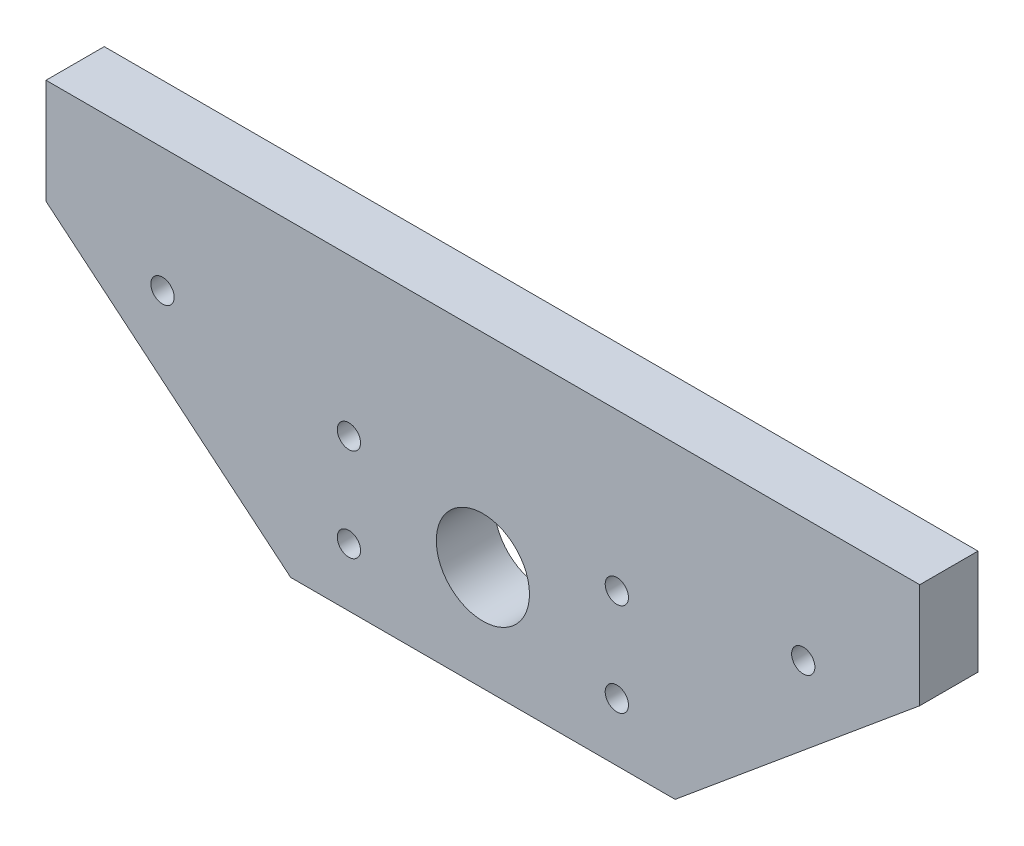
ISO-10303-21;
HEADER;
FILE_DESCRIPTION(('STEP AP214'),'2;1');
FILE_NAME('part.step','',(''),(''),'','','');
FILE_SCHEMA(('AUTOMOTIVE_DESIGN { 1 0 10303 214 1 1 1 1 }'));
ENDSEC;
DATA;
#1=APPLICATION_CONTEXT('core data for automotive mechanical design processes');
#2=APPLICATION_PROTOCOL_DEFINITION('international standard','automotive_design',2000,#1);
#3=PRODUCT_CONTEXT('',#1,'mechanical');
#4=PRODUCT('Part','Part','',(#3));
#5=PRODUCT_RELATED_PRODUCT_CATEGORY('part','',(#4));
#6=PRODUCT_DEFINITION_FORMATION('','',#4);
#7=PRODUCT_DEFINITION_CONTEXT('part definition',#1,'design');
#8=PRODUCT_DEFINITION('design','',#6,#7);
#9=PRODUCT_DEFINITION_SHAPE('','',#8);
#10=(LENGTH_UNIT() NAMED_UNIT(*) SI_UNIT(.MILLI.,.METRE.));
#11=(NAMED_UNIT(*) PLANE_ANGLE_UNIT() SI_UNIT($,.RADIAN.));
#12=(NAMED_UNIT(*) SI_UNIT($,.STERADIAN.) SOLID_ANGLE_UNIT());
#13=UNCERTAINTY_MEASURE_WITH_UNIT(LENGTH_MEASURE(1.E-05),#10,'distance_accuracy_value','');
#14=(GEOMETRIC_REPRESENTATION_CONTEXT(3) GLOBAL_UNCERTAINTY_ASSIGNED_CONTEXT((#13)) GLOBAL_UNIT_ASSIGNED_CONTEXT((#10,
#11,#12)) REPRESENTATION_CONTEXT('',''));
#15=CARTESIAN_POINT('',(0.,0.,0.));
#16=DIRECTION('',(0.,0.,1.));
#17=DIRECTION('',(1.,0.,0.));
#18=AXIS2_PLACEMENT_3D('',#15,#16,#17);
#19=CARTESIAN_POINT('',(0.,0.,10.));
#20=DIRECTION('',(0.,0.,1.));
#21=DIRECTION('',(1.,0.,0.));
#22=AXIS2_PLACEMENT_3D('',#19,#20,#21);
#23=PLANE('',#22);
#24=DIRECTION('',(-0.768948531530423,-0.639310688051753,0.));
#25=VECTOR('',#24,1.);
#26=CARTESIAN_POINT('',(75.,16.9191757278377,10.));
#27=LINE('',#26,#25);
#28=CARTESIAN_POINT('',(75.,16.9191757278377,10.));
#29=VERTEX_POINT('',#28);
#30=CARTESIAN_POINT('',(33.,-18.,10.));
#31=VERTEX_POINT('',#30);
#32=EDGE_CURVE('E155',#29,#31,#27,.T.);
#33=ORIENTED_EDGE('',*,*,#32,.F.);
#34=DIRECTION('',(0.,1.,0.));
#35=VECTOR('',#34,1.);
#36=CARTESIAN_POINT('',(75.,34.9191757278377,10.));
#37=LINE('',#36,#35);
#38=CARTESIAN_POINT('',(75.,34.9191757278377,10.));
#39=VERTEX_POINT('',#38);
#40=EDGE_CURVE('E95',#29,#39,#37,.T.);
#41=ORIENTED_EDGE('',*,*,#40,.T.);
#42=DIRECTION('',(-1.,0.,0.));
#43=VECTOR('',#42,1.);
#44=CARTESIAN_POINT('',(-75.,34.9191757278377,10.));
#45=LINE('',#44,#43);
#46=CARTESIAN_POINT('',(-75.,34.9191757278377,10.));
#47=VERTEX_POINT('',#46);
#48=EDGE_CURVE('E61',#39,#47,#45,.T.);
#49=ORIENTED_EDGE('',*,*,#48,.T.);
#50=DIRECTION('',(0.,-1.,0.));
#51=VECTOR('',#50,1.);
#52=CARTESIAN_POINT('',(-75.,34.9191757278377,10.));
#53=LINE('',#52,#51);
#54=CARTESIAN_POINT('',(-75.,16.9191757278377,10.));
#55=VERTEX_POINT('',#54);
#56=EDGE_CURVE('E88',#47,#55,#53,.T.);
#57=ORIENTED_EDGE('',*,*,#56,.T.);
#58=DIRECTION('',(-0.768948531530424,0.639310688051752,0.));
#59=VECTOR('',#58,1.);
#60=CARTESIAN_POINT('',(-75.,16.9191757278377,10.));
#61=LINE('',#60,#59);
#62=CARTESIAN_POINT('',(-33.,-18.,10.));
#63=VERTEX_POINT('',#62);
#64=EDGE_CURVE('E52',#63,#55,#61,.T.);
#65=ORIENTED_EDGE('',*,*,#64,.F.);
#66=DIRECTION('',(-1.,0.,0.));
#67=VECTOR('',#66,1.);
#68=CARTESIAN_POINT('',(-33.,-18.,10.));
#69=LINE('',#68,#67);
#70=EDGE_CURVE('E160',#31,#63,#69,.T.);
#71=ORIENTED_EDGE('',*,*,#70,.F.);
#72=EDGE_LOOP('',(#33,#41,#49,#57,#65,#71));
#73=FACE_BOUND('',#72,.T.);
#74=CARTESIAN_POINT('',(55.,13.6490091899119,10.));
#75=DIRECTION('',(0.,0.,1.));
#76=DIRECTION('',(-1.,0.,0.));
#77=AXIS2_PLACEMENT_3D('',#74,#75,#76);
#78=CIRCLE('',#77,2.);
#79=CARTESIAN_POINT('',(53.,13.6490091899119,10.));
#80=VERTEX_POINT('',#79);
#81=EDGE_CURVE('E139',#80,#80,#78,.T.);
#82=ORIENTED_EDGE('',*,*,#81,.F.);
#83=EDGE_LOOP('',(#82));
#84=FACE_BOUND('',#83,.T.);
#85=CARTESIAN_POINT('',(-55.,13.6490091899118,10.));
#86=DIRECTION('',(0.,0.,1.));
#87=DIRECTION('',(1.,0.,0.));
#88=AXIS2_PLACEMENT_3D('',#85,#86,#87);
#89=CIRCLE('',#88,2.);
#90=CARTESIAN_POINT('',(-53.,13.6490091899118,10.));
#91=VERTEX_POINT('',#90);
#92=EDGE_CURVE('E133',#91,#91,#89,.T.);
#93=ORIENTED_EDGE('',*,*,#92,.F.);
#94=EDGE_LOOP('',(#93));
#95=FACE_BOUND('',#94,.T.);
#96=CARTESIAN_POINT('',(-23.,-8.,10.));
#97=DIRECTION('',(0.,0.,-1.));
#98=DIRECTION('',(-1.,0.,0.));
#99=AXIS2_PLACEMENT_3D('',#96,#97,#98);
#100=CIRCLE('',#99,2.);
#101=CARTESIAN_POINT('',(-25.,-8.,10.));
#102=VERTEX_POINT('',#101);
#103=EDGE_CURVE('E112',#102,#102,#100,.T.);
#104=ORIENTED_EDGE('',*,*,#103,.T.);
#105=EDGE_LOOP('',(#104));
#106=FACE_BOUND('',#105,.T.);
#107=CARTESIAN_POINT('',(-23.,8.,10.));
#108=DIRECTION('',(0.,0.,1.));
#109=DIRECTION('',(1.,0.,0.));
#110=AXIS2_PLACEMENT_3D('',#107,#108,#109);
#111=CIRCLE('',#110,2.);
#112=CARTESIAN_POINT('',(-21.,8.,10.));
#113=VERTEX_POINT('',#112);
#114=EDGE_CURVE('E109',#113,#113,#111,.T.);
#115=ORIENTED_EDGE('',*,*,#114,.F.);
#116=EDGE_LOOP('',(#115));
#117=FACE_BOUND('',#116,.T.);
#118=CARTESIAN_POINT('',(0.,0.,10.));
#119=DIRECTION('',(0.,0.,1.));
#120=DIRECTION('',(1.,0.,0.));
#121=AXIS2_PLACEMENT_3D('',#118,#119,#120);
#122=CIRCLE('',#121,8.);
#123=CARTESIAN_POINT('',(8.,0.,10.));
#124=VERTEX_POINT('',#123);
#125=EDGE_CURVE('E103',#124,#124,#122,.T.);
#126=ORIENTED_EDGE('',*,*,#125,.F.);
#127=EDGE_LOOP('',(#126));
#128=FACE_BOUND('',#127,.T.);
#129=CARTESIAN_POINT('',(23.,-8.,10.));
#130=DIRECTION('',(0.,0.,1.));
#131=DIRECTION('',(1.,0.,0.));
#132=AXIS2_PLACEMENT_3D('',#129,#130,#131);
#133=CIRCLE('',#132,2.);
#134=CARTESIAN_POINT('',(25.,-8.,10.));
#135=VERTEX_POINT('',#134);
#136=EDGE_CURVE('E125',#135,#135,#133,.T.);
#137=ORIENTED_EDGE('',*,*,#136,.F.);
#138=EDGE_LOOP('',(#137));
#139=FACE_BOUND('',#138,.T.);
#140=CARTESIAN_POINT('',(23.,8.,10.));
#141=DIRECTION('',(0.,0.,-1.));
#142=DIRECTION('',(-1.,0.,0.));
#143=AXIS2_PLACEMENT_3D('',#140,#141,#142);
#144=CIRCLE('',#143,2.);
#145=CARTESIAN_POINT('',(21.,8.,10.));
#146=VERTEX_POINT('',#145);
#147=EDGE_CURVE('E118',#146,#146,#144,.T.);
#148=ORIENTED_EDGE('',*,*,#147,.T.);
#149=EDGE_LOOP('',(#148));
#150=FACE_BOUND('',#149,.T.);
#151=ADVANCED_FACE('F37',(#73,#84,#95,#106,#117,#128,#139,#150),#23,.T.);
#152=CARTESIAN_POINT('',(0.,0.,0.));
#153=DIRECTION('',(0.,0.,1.));
#154=DIRECTION('',(1.,0.,0.));
#155=AXIS2_PLACEMENT_3D('',#152,#153,#154);
#156=PLANE('',#155);
#157=CARTESIAN_POINT('',(55.,13.6490091899119,0.));
#158=DIRECTION('',(0.,0.,1.));
#159=DIRECTION('',(-1.,0.,0.));
#160=AXIS2_PLACEMENT_3D('',#157,#158,#159);
#161=CIRCLE('',#160,2.);
#162=CARTESIAN_POINT('',(53.,13.6490091899119,0.));
#163=VERTEX_POINT('',#162);
#164=EDGE_CURVE('E136',#163,#163,#161,.T.);
#165=ORIENTED_EDGE('',*,*,#164,.T.);
#166=EDGE_LOOP('',(#165));
#167=FACE_BOUND('',#166,.T.);
#168=CARTESIAN_POINT('',(-55.,13.6490091899118,0.));
#169=DIRECTION('',(0.,0.,1.));
#170=DIRECTION('',(1.,0.,0.));
#171=AXIS2_PLACEMENT_3D('',#168,#169,#170);
#172=CIRCLE('',#171,2.);
#173=CARTESIAN_POINT('',(-53.,13.6490091899118,0.));
#174=VERTEX_POINT('',#173);
#175=EDGE_CURVE('E119',#174,#174,#172,.T.);
#176=ORIENTED_EDGE('',*,*,#175,.T.);
#177=EDGE_LOOP('',(#176));
#178=FACE_BOUND('',#177,.T.);
#179=CARTESIAN_POINT('',(23.,-8.,0.));
#180=DIRECTION('',(0.,0.,1.));
#181=DIRECTION('',(1.,0.,0.));
#182=AXIS2_PLACEMENT_3D('',#179,#180,#181);
#183=CIRCLE('',#182,2.);
#184=CARTESIAN_POINT('',(25.,-8.,0.));
#185=VERTEX_POINT('',#184);
#186=EDGE_CURVE('E122',#185,#185,#183,.T.);
#187=ORIENTED_EDGE('',*,*,#186,.T.);
#188=EDGE_LOOP('',(#187));
#189=FACE_BOUND('',#188,.T.);
#190=CARTESIAN_POINT('',(-23.,8.,0.));
#191=DIRECTION('',(0.,0.,1.));
#192=DIRECTION('',(1.,0.,0.));
#193=AXIS2_PLACEMENT_3D('',#190,#191,#192);
#194=CIRCLE('',#193,2.);
#195=CARTESIAN_POINT('',(-21.,8.,0.));
#196=VERTEX_POINT('',#195);
#197=EDGE_CURVE('E106',#196,#196,#194,.T.);
#198=ORIENTED_EDGE('',*,*,#197,.T.);
#199=EDGE_LOOP('',(#198));
#200=FACE_BOUND('',#199,.T.);
#201=CARTESIAN_POINT('',(0.,0.,0.));
#202=DIRECTION('',(0.,0.,1.));
#203=DIRECTION('',(1.,0.,0.));
#204=AXIS2_PLACEMENT_3D('',#201,#202,#203);
#205=CIRCLE('',#204,8.);
#206=CARTESIAN_POINT('',(8.,0.,0.));
#207=VERTEX_POINT('',#206);
#208=EDGE_CURVE('E100',#207,#207,#205,.T.);
#209=ORIENTED_EDGE('',*,*,#208,.T.);
#210=EDGE_LOOP('',(#209));
#211=FACE_BOUND('',#210,.T.);
#212=DIRECTION('',(0.,1.,0.));
#213=VECTOR('',#212,1.);
#214=CARTESIAN_POINT('',(75.,34.9191757278377,0.));
#215=LINE('',#214,#213);
#216=CARTESIAN_POINT('',(75.,16.9191757278377,0.));
#217=VERTEX_POINT('',#216);
#218=CARTESIAN_POINT('',(75.,34.9191757278377,0.));
#219=VERTEX_POINT('',#218);
#220=EDGE_CURVE('E82',#217,#219,#215,.T.);
#221=ORIENTED_EDGE('',*,*,#220,.F.);
#222=DIRECTION('',(-0.768948531530423,-0.639310688051753,0.));
#223=VECTOR('',#222,1.);
#224=CARTESIAN_POINT('',(75.,16.9191757278377,0.));
#225=LINE('',#224,#223);
#226=CARTESIAN_POINT('',(33.,-18.,0.));
#227=VERTEX_POINT('',#226);
#228=EDGE_CURVE('E148',#217,#227,#225,.T.);
#229=ORIENTED_EDGE('',*,*,#228,.T.);
#230=DIRECTION('',(-1.,0.,0.));
#231=VECTOR('',#230,1.);
#232=CARTESIAN_POINT('',(-33.,-18.,0.));
#233=LINE('',#232,#231);
#234=CARTESIAN_POINT('',(-33.,-18.,0.));
#235=VERTEX_POINT('',#234);
#236=EDGE_CURVE('E158',#227,#235,#233,.T.);
#237=ORIENTED_EDGE('',*,*,#236,.T.);
#238=DIRECTION('',(-0.768948531530424,0.639310688051752,0.));
#239=VECTOR('',#238,1.);
#240=CARTESIAN_POINT('',(-75.,16.9191757278377,0.));
#241=LINE('',#240,#239);
#242=CARTESIAN_POINT('',(-75.,16.9191757278377,0.));
#243=VERTEX_POINT('',#242);
#244=EDGE_CURVE('E94',#235,#243,#241,.T.);
#245=ORIENTED_EDGE('',*,*,#244,.T.);
#246=DIRECTION('',(0.,-1.,0.));
#247=VECTOR('',#246,1.);
#248=CARTESIAN_POINT('',(-75.,34.9191757278377,0.));
#249=LINE('',#248,#247);
#250=CARTESIAN_POINT('',(-75.,34.9191757278377,0.));
#251=VERTEX_POINT('',#250);
#252=EDGE_CURVE('E81',#251,#243,#249,.T.);
#253=ORIENTED_EDGE('',*,*,#252,.F.);
#254=DIRECTION('',(-1.,0.,0.));
#255=VECTOR('',#254,1.);
#256=CARTESIAN_POINT('',(-75.,34.9191757278377,0.));
#257=LINE('',#256,#255);
#258=EDGE_CURVE('E73',#219,#251,#257,.T.);
#259=ORIENTED_EDGE('',*,*,#258,.F.);
#260=EDGE_LOOP('',(#221,#229,#237,#245,#253,#259));
#261=FACE_BOUND('',#260,.T.);
#262=CARTESIAN_POINT('',(-23.,-8.,0.));
#263=DIRECTION('',(0.,0.,-1.));
#264=DIRECTION('',(-1.,0.,0.));
#265=AXIS2_PLACEMENT_3D('',#262,#263,#264);
#266=CIRCLE('',#265,2.);
#267=CARTESIAN_POINT('',(-25.,-8.,0.));
#268=VERTEX_POINT('',#267);
#269=EDGE_CURVE('E128',#268,#268,#266,.T.);
#270=ORIENTED_EDGE('',*,*,#269,.F.);
#271=EDGE_LOOP('',(#270));
#272=FACE_BOUND('',#271,.T.);
#273=CARTESIAN_POINT('',(23.,8.,0.));
#274=DIRECTION('',(0.,0.,-1.));
#275=DIRECTION('',(-1.,0.,0.));
#276=AXIS2_PLACEMENT_3D('',#273,#274,#275);
#277=CIRCLE('',#276,2.);
#278=CARTESIAN_POINT('',(21.,8.,0.));
#279=VERTEX_POINT('',#278);
#280=EDGE_CURVE('E115',#279,#279,#277,.T.);
#281=ORIENTED_EDGE('',*,*,#280,.F.);
#282=EDGE_LOOP('',(#281));
#283=FACE_BOUND('',#282,.T.);
#284=ADVANCED_FACE('F90',(#167,#178,#189,#200,#211,#261,#272,#283),#156,.F.);
#285=CARTESIAN_POINT('',(75.,34.9191757278377,10.));
#286=DIRECTION('',(-1.,0.,0.));
#287=DIRECTION('',(0.,-1.,0.));
#288=AXIS2_PLACEMENT_3D('',#285,#286,#287);
#289=PLANE('',#288);
#290=ORIENTED_EDGE('',*,*,#40,.F.);
#291=DIRECTION('',(0.,0.,1.));
#292=VECTOR('',#291,1.);
#293=CARTESIAN_POINT('',(75.,16.9191757278377,0.));
#294=LINE('',#293,#292);
#295=EDGE_CURVE('E150',#217,#29,#294,.T.);
#296=ORIENTED_EDGE('',*,*,#295,.F.);
#297=ORIENTED_EDGE('',*,*,#220,.T.);
#298=DIRECTION('',(0.,0.,-1.));
#299=VECTOR('',#298,1.);
#300=CARTESIAN_POINT('',(75.,34.9191757278377,10.));
#301=LINE('',#300,#299);
#302=EDGE_CURVE('E11',#39,#219,#301,.T.);
#303=ORIENTED_EDGE('',*,*,#302,.F.);
#304=EDGE_LOOP('',(#290,#296,#297,#303));
#305=FACE_BOUND('',#304,.T.);
#306=ADVANCED_FACE('F39',(#305),#289,.F.);
#307=CARTESIAN_POINT('',(-75.,34.9191757278377,10.));
#308=DIRECTION('',(0.,-1.,0.));
#309=DIRECTION('',(0.,0.,-1.));
#310=AXIS2_PLACEMENT_3D('',#307,#308,#309);
#311=PLANE('',#310);
#312=ORIENTED_EDGE('',*,*,#258,.T.);
#313=DIRECTION('',(0.,0.,-1.));
#314=VECTOR('',#313,1.);
#315=CARTESIAN_POINT('',(-75.,34.9191757278377,10.));
#316=LINE('',#315,#314);
#317=EDGE_CURVE('E45',#47,#251,#316,.T.);
#318=ORIENTED_EDGE('',*,*,#317,.F.);
#319=ORIENTED_EDGE('',*,*,#48,.F.);
#320=ORIENTED_EDGE('',*,*,#302,.T.);
#321=EDGE_LOOP('',(#312,#318,#319,#320));
#322=FACE_BOUND('',#321,.T.);
#323=ADVANCED_FACE('F75',(#322),#311,.F.);
#324=CARTESIAN_POINT('',(-75.,34.9191757278377,10.));
#325=DIRECTION('',(1.,0.,0.));
#326=DIRECTION('',(0.,0.,-1.));
#327=AXIS2_PLACEMENT_3D('',#324,#325,#326);
#328=PLANE('',#327);
#329=ORIENTED_EDGE('',*,*,#252,.T.);
#330=DIRECTION('',(0.,0.,1.));
#331=VECTOR('',#330,1.);
#332=CARTESIAN_POINT('',(-75.,16.9191757278377,0.));
#333=LINE('',#332,#331);
#334=EDGE_CURVE('E147',#243,#55,#333,.T.);
#335=ORIENTED_EDGE('',*,*,#334,.T.);
#336=ORIENTED_EDGE('',*,*,#56,.F.);
#337=ORIENTED_EDGE('',*,*,#317,.T.);
#338=EDGE_LOOP('',(#329,#335,#336,#337));
#339=FACE_BOUND('',#338,.T.);
#340=ADVANCED_FACE('F86',(#339),#328,.F.);
#341=CARTESIAN_POINT('',(0.,0.,0.));
#342=DIRECTION('',(0.,0.,1.));
#343=DIRECTION('',(1.,0.,0.));
#344=AXIS2_PLACEMENT_3D('',#341,#342,#343);
#345=CYLINDRICAL_SURFACE('',#344,8.);
#346=ORIENTED_EDGE('',*,*,#208,.F.);
#347=EDGE_LOOP('',(#346));
#348=FACE_BOUND('',#347,.T.);
#349=ORIENTED_EDGE('',*,*,#125,.T.);
#350=EDGE_LOOP('',(#349));
#351=FACE_BOUND('',#350,.T.);
#352=ADVANCED_FACE('F203',(#348,#351),#345,.F.);
#353=CARTESIAN_POINT('',(-23.,8.,0.));
#354=DIRECTION('',(0.,0.,1.));
#355=DIRECTION('',(1.,0.,0.));
#356=AXIS2_PLACEMENT_3D('',#353,#354,#355);
#357=CYLINDRICAL_SURFACE('',#356,2.);
#358=ORIENTED_EDGE('',*,*,#197,.F.);
#359=EDGE_LOOP('',(#358));
#360=FACE_BOUND('',#359,.T.);
#361=ORIENTED_EDGE('',*,*,#114,.T.);
#362=EDGE_LOOP('',(#361));
#363=FACE_BOUND('',#362,.T.);
#364=ADVANCED_FACE('F210',(#360,#363),#357,.F.);
#365=CARTESIAN_POINT('',(-23.,-8.,0.));
#366=DIRECTION('',(0.,0.,1.));
#367=DIRECTION('',(1.,0.,0.));
#368=AXIS2_PLACEMENT_3D('',#365,#366,#367);
#369=CYLINDRICAL_SURFACE('',#368,2.);
#370=ORIENTED_EDGE('',*,*,#269,.T.);
#371=EDGE_LOOP('',(#370));
#372=FACE_BOUND('',#371,.T.);
#373=ORIENTED_EDGE('',*,*,#103,.F.);
#374=EDGE_LOOP('',(#373));
#375=FACE_BOUND('',#374,.T.);
#376=ADVANCED_FACE('F215',(#372,#375),#369,.F.);
#377=CARTESIAN_POINT('',(23.,-8.,0.));
#378=DIRECTION('',(0.,0.,1.));
#379=DIRECTION('',(1.,0.,0.));
#380=AXIS2_PLACEMENT_3D('',#377,#378,#379);
#381=CYLINDRICAL_SURFACE('',#380,2.);
#382=ORIENTED_EDGE('',*,*,#186,.F.);
#383=EDGE_LOOP('',(#382));
#384=FACE_BOUND('',#383,.T.);
#385=ORIENTED_EDGE('',*,*,#136,.T.);
#386=EDGE_LOOP('',(#385));
#387=FACE_BOUND('',#386,.T.);
#388=ADVANCED_FACE('F229',(#384,#387),#381,.F.);
#389=CARTESIAN_POINT('',(23.,8.,0.));
#390=DIRECTION('',(0.,0.,1.));
#391=DIRECTION('',(1.,0.,0.));
#392=AXIS2_PLACEMENT_3D('',#389,#390,#391);
#393=CYLINDRICAL_SURFACE('',#392,2.);
#394=ORIENTED_EDGE('',*,*,#280,.T.);
#395=EDGE_LOOP('',(#394));
#396=FACE_BOUND('',#395,.T.);
#397=ORIENTED_EDGE('',*,*,#147,.F.);
#398=EDGE_LOOP('',(#397));
#399=FACE_BOUND('',#398,.T.);
#400=ADVANCED_FACE('F226',(#396,#399),#393,.F.);
#401=CARTESIAN_POINT('',(-55.,13.6490091899118,0.));
#402=DIRECTION('',(0.,0.,1.));
#403=DIRECTION('',(1.,0.,0.));
#404=AXIS2_PLACEMENT_3D('',#401,#402,#403);
#405=CYLINDRICAL_SURFACE('',#404,2.);
#406=ORIENTED_EDGE('',*,*,#175,.F.);
#407=EDGE_LOOP('',(#406));
#408=FACE_BOUND('',#407,.T.);
#409=ORIENTED_EDGE('',*,*,#92,.T.);
#410=EDGE_LOOP('',(#409));
#411=FACE_BOUND('',#410,.T.);
#412=ADVANCED_FACE('F228',(#408,#411),#405,.F.);
#413=CARTESIAN_POINT('',(55.,13.6490091899119,0.));
#414=DIRECTION('',(0.,0.,1.));
#415=DIRECTION('',(1.,0.,0.));
#416=AXIS2_PLACEMENT_3D('',#413,#414,#415);
#417=CYLINDRICAL_SURFACE('',#416,2.);
#418=ORIENTED_EDGE('',*,*,#164,.F.);
#419=EDGE_LOOP('',(#418));
#420=FACE_BOUND('',#419,.T.);
#421=ORIENTED_EDGE('',*,*,#81,.T.);
#422=EDGE_LOOP('',(#421));
#423=FACE_BOUND('',#422,.T.);
#424=ADVANCED_FACE('F236',(#420,#423),#417,.F.);
#425=CARTESIAN_POINT('',(-33.,-18.,0.));
#426=DIRECTION('',(0.,1.,0.));
#427=DIRECTION('',(0.,0.,1.));
#428=AXIS2_PLACEMENT_3D('',#425,#426,#427);
#429=PLANE('',#428);
#430=ORIENTED_EDGE('',*,*,#70,.T.);
#431=DIRECTION('',(0.,0.,1.));
#432=VECTOR('',#431,1.);
#433=CARTESIAN_POINT('',(-33.,-18.,0.));
#434=LINE('',#433,#432);
#435=EDGE_CURVE('E145',#235,#63,#434,.T.);
#436=ORIENTED_EDGE('',*,*,#435,.F.);
#437=ORIENTED_EDGE('',*,*,#236,.F.);
#438=DIRECTION('',(0.,0.,1.));
#439=VECTOR('',#438,1.);
#440=CARTESIAN_POINT('',(33.,-18.,0.));
#441=LINE('',#440,#439);
#442=EDGE_CURVE('E142',#227,#31,#441,.T.);
#443=ORIENTED_EDGE('',*,*,#442,.T.);
#444=EDGE_LOOP('',(#430,#436,#437,#443));
#445=FACE_BOUND('',#444,.T.);
#446=ADVANCED_FACE('F173',(#445),#429,.F.);
#447=CARTESIAN_POINT('',(75.,16.9191757278377,0.));
#448=DIRECTION('',(-0.639310688051753,0.768948531530423,0.));
#449=DIRECTION('',(-0.768948531530423,-0.639310688051753,0.));
#450=AXIS2_PLACEMENT_3D('',#447,#448,#449);
#451=PLANE('',#450);
#452=ORIENTED_EDGE('',*,*,#32,.T.);
#453=ORIENTED_EDGE('',*,*,#442,.F.);
#454=ORIENTED_EDGE('',*,*,#228,.F.);
#455=ORIENTED_EDGE('',*,*,#295,.T.);
#456=EDGE_LOOP('',(#452,#453,#454,#455));
#457=FACE_BOUND('',#456,.T.);
#458=ADVANCED_FACE('F186',(#457),#451,.F.);
#459=CARTESIAN_POINT('',(-75.,16.9191757278377,0.));
#460=DIRECTION('',(0.639310688051752,0.768948531530424,0.));
#461=DIRECTION('',(-0.768948531530424,0.639310688051752,0.));
#462=AXIS2_PLACEMENT_3D('',#459,#460,#461);
#463=PLANE('',#462);
#464=ORIENTED_EDGE('',*,*,#64,.T.);
#465=ORIENTED_EDGE('',*,*,#334,.F.);
#466=ORIENTED_EDGE('',*,*,#244,.F.);
#467=ORIENTED_EDGE('',*,*,#435,.T.);
#468=EDGE_LOOP('',(#464,#465,#466,#467));
#469=FACE_BOUND('',#468,.T.);
#470=ADVANCED_FACE('F250',(#469),#463,.F.);
#471=CLOSED_SHELL('',(#151,#284,#306,#323,#340,#352,#364,#376,#388,#400,#412,#424,#446,#458,#470));
#472=MANIFOLD_SOLID_BREP('B2',#471);
#473=ADVANCED_BREP_SHAPE_REPRESENTATION('',(#18,#472),#14);
#474=SHAPE_DEFINITION_REPRESENTATION(#9,#473);
ENDSEC;
END-ISO-10303-21;
